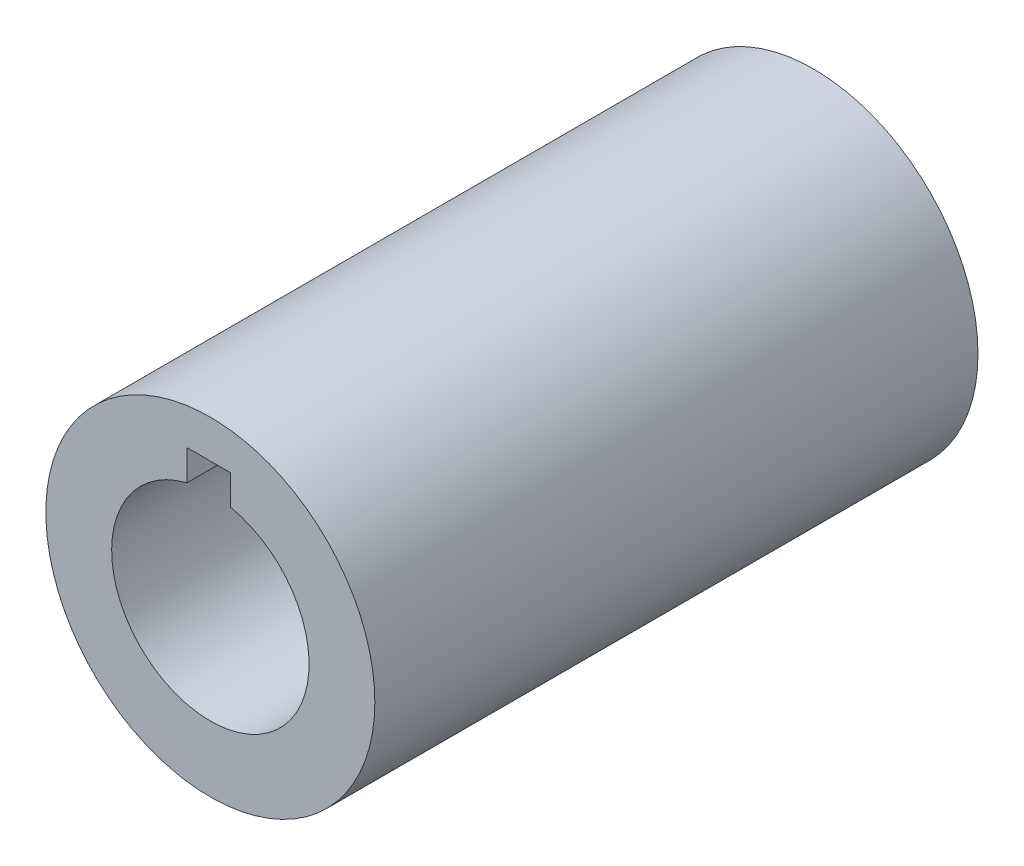
ISO-10303-21;
HEADER;
FILE_DESCRIPTION(('STEP AP214'),'2;1');
FILE_NAME('part.step','',(''),(''),'','','');
FILE_SCHEMA(('AUTOMOTIVE_DESIGN { 1 0 10303 214 1 1 1 1 }'));
ENDSEC;
DATA;
#1=APPLICATION_CONTEXT('core data for automotive mechanical design processes');
#2=APPLICATION_PROTOCOL_DEFINITION('international standard','automotive_design',2000,#1);
#3=PRODUCT_CONTEXT('',#1,'mechanical');
#4=PRODUCT('Part','Part','',(#3));
#5=PRODUCT_RELATED_PRODUCT_CATEGORY('part','',(#4));
#6=PRODUCT_DEFINITION_FORMATION('','',#4);
#7=PRODUCT_DEFINITION_CONTEXT('part definition',#1,'design');
#8=PRODUCT_DEFINITION('design','',#6,#7);
#9=PRODUCT_DEFINITION_SHAPE('','',#8);
#10=(LENGTH_UNIT() NAMED_UNIT(*) SI_UNIT(.MILLI.,.METRE.));
#11=(NAMED_UNIT(*) PLANE_ANGLE_UNIT() SI_UNIT($,.RADIAN.));
#12=(NAMED_UNIT(*) SI_UNIT($,.STERADIAN.) SOLID_ANGLE_UNIT());
#13=UNCERTAINTY_MEASURE_WITH_UNIT(LENGTH_MEASURE(1.E-05),#10,'distance_accuracy_value','');
#14=(GEOMETRIC_REPRESENTATION_CONTEXT(3) GLOBAL_UNCERTAINTY_ASSIGNED_CONTEXT((#13)) GLOBAL_UNIT_ASSIGNED_CONTEXT((#10,
#11,#12)) REPRESENTATION_CONTEXT('',''));
#15=CARTESIAN_POINT('',(0.,0.,0.));
#16=DIRECTION('',(0.,0.,1.));
#17=DIRECTION('',(1.,0.,0.));
#18=AXIS2_PLACEMENT_3D('',#15,#16,#17);
#19=CARTESIAN_POINT('',(0.142780767742801,-8.51132170729918,55.));
#20=DIRECTION('',(0.,0.,1.));
#21=DIRECTION('',(1.,0.,0.));
#22=AXIS2_PLACEMENT_3D('',#19,#20,#21);
#23=PLANE('',#22);
#24=CARTESIAN_POINT('',(0.142780767742801,-8.51132170729918,55.));
#25=DIRECTION('',(0.,0.,1.));
#26=DIRECTION('',(1.,0.,0.));
#27=AXIS2_PLACEMENT_3D('',#24,#25,#26);
#28=CIRCLE('',#27,15.);
#29=CARTESIAN_POINT('',(15.1427807677428,-8.51132170729918,55.));
#30=VERTEX_POINT('',#29);
#31=EDGE_CURVE('E11',#30,#30,#28,.T.);
#32=ORIENTED_EDGE('',*,*,#31,.T.);
#33=EDGE_LOOP('',(#32));
#34=FACE_BOUND('',#33,.T.);
#35=DIRECTION('',(-1.,0.,0.));
#36=VECTOR('',#35,1.);
#37=CARTESIAN_POINT('',(2.,3.01641607289805,55.));
#38=LINE('',#37,#36);
#39=CARTESIAN_POINT('',(2.,3.01641607289805,55.));
#40=VERTEX_POINT('',#39);
#41=CARTESIAN_POINT('',(-2.,3.01641607289805,55.));
#42=VERTEX_POINT('',#41);
#43=EDGE_CURVE('E82',#40,#42,#38,.T.);
#44=ORIENTED_EDGE('',*,*,#43,.F.);
#45=DIRECTION('',(0.,1.,0.));
#46=VECTOR('',#45,1.);
#47=CARTESIAN_POINT('',(2.,3.01641607289805,55.));
#48=LINE('',#47,#46);
#49=CARTESIAN_POINT('',(2.,0.294967904298546,55.));
#50=VERTEX_POINT('',#49);
#51=EDGE_CURVE('E74',#50,#40,#48,.T.);
#52=ORIENTED_EDGE('',*,*,#51,.F.);
#53=CARTESIAN_POINT('',(0.142780767742801,-8.51132170729918,55.));
#54=DIRECTION('',(0.,0.,1.));
#55=DIRECTION('',(1.,0.,0.));
#56=AXIS2_PLACEMENT_3D('',#53,#54,#55);
#57=CIRCLE('',#56,9.);
#58=CARTESIAN_POINT('',(-2.,0.229873324353622,55.));
#59=VERTEX_POINT('',#58);
#60=EDGE_CURVE('E95',#59,#50,#57,.T.);
#61=ORIENTED_EDGE('',*,*,#60,.F.);
#62=DIRECTION('',(0.,-1.,0.));
#63=VECTOR('',#62,1.);
#64=CARTESIAN_POINT('',(-2.,3.01641607289805,55.));
#65=LINE('',#64,#63);
#66=EDGE_CURVE('E93',#42,#59,#65,.T.);
#67=ORIENTED_EDGE('',*,*,#66,.F.);
#68=EDGE_LOOP('',(#44,#52,#61,#67));
#69=FACE_BOUND('',#68,.T.);
#70=ADVANCED_FACE('F33',(#34,#69),#23,.T.);
#71=CARTESIAN_POINT('',(0.142780767742801,-8.51132170729918,0.));
#72=DIRECTION('',(0.,0.,1.));
#73=DIRECTION('',(1.,0.,0.));
#74=AXIS2_PLACEMENT_3D('',#71,#72,#73);
#75=PLANE('',#74);
#76=CARTESIAN_POINT('',(0.142780767742801,-8.51132170729918,0.));
#77=DIRECTION('',(0.,0.,1.));
#78=DIRECTION('',(1.,0.,0.));
#79=AXIS2_PLACEMENT_3D('',#76,#77,#78);
#80=CIRCLE('',#79,15.);
#81=CARTESIAN_POINT('',(15.1427807677428,-8.51132170729918,0.));
#82=VERTEX_POINT('',#81);
#83=EDGE_CURVE('E37',#82,#82,#80,.T.);
#84=ORIENTED_EDGE('',*,*,#83,.F.);
#85=EDGE_LOOP('',(#84));
#86=FACE_BOUND('',#85,.T.);
#87=DIRECTION('',(0.,1.,0.));
#88=VECTOR('',#87,1.);
#89=CARTESIAN_POINT('',(2.,3.01641607289805,0.));
#90=LINE('',#89,#88);
#91=CARTESIAN_POINT('',(2.,0.294967904298546,0.));
#92=VERTEX_POINT('',#91);
#93=CARTESIAN_POINT('',(2.,3.01641607289805,0.));
#94=VERTEX_POINT('',#93);
#95=EDGE_CURVE('E56',#92,#94,#90,.T.);
#96=ORIENTED_EDGE('',*,*,#95,.T.);
#97=DIRECTION('',(-1.,0.,0.));
#98=VECTOR('',#97,1.);
#99=CARTESIAN_POINT('',(2.,3.01641607289805,0.));
#100=LINE('',#99,#98);
#101=CARTESIAN_POINT('',(-2.,3.01641607289805,0.));
#102=VERTEX_POINT('',#101);
#103=EDGE_CURVE('E89',#94,#102,#100,.T.);
#104=ORIENTED_EDGE('',*,*,#103,.T.);
#105=DIRECTION('',(0.,-1.,0.));
#106=VECTOR('',#105,1.);
#107=CARTESIAN_POINT('',(-2.,3.01641607289805,0.));
#108=LINE('',#107,#106);
#109=CARTESIAN_POINT('',(-2.,0.229873324353622,0.));
#110=VERTEX_POINT('',#109);
#111=EDGE_CURVE('E101',#102,#110,#108,.T.);
#112=ORIENTED_EDGE('',*,*,#111,.T.);
#113=CARTESIAN_POINT('',(0.142780767742801,-8.51132170729918,0.));
#114=DIRECTION('',(0.,0.,1.));
#115=DIRECTION('',(1.,0.,0.));
#116=AXIS2_PLACEMENT_3D('',#113,#114,#115);
#117=CIRCLE('',#116,9.);
#118=EDGE_CURVE('E83',#110,#92,#117,.T.);
#119=ORIENTED_EDGE('',*,*,#118,.T.);
#120=EDGE_LOOP('',(#96,#104,#112,#119));
#121=FACE_BOUND('',#120,.T.);
#122=ADVANCED_FACE('F112',(#86,#121),#75,.F.);
#123=CARTESIAN_POINT('',(0.142780767742801,-8.51132170729918,55.));
#124=DIRECTION('',(0.,0.,-1.));
#125=DIRECTION('',(-1.,0.,0.));
#126=AXIS2_PLACEMENT_3D('',#123,#124,#125);
#127=CYLINDRICAL_SURFACE('',#126,15.);
#128=ORIENTED_EDGE('',*,*,#31,.F.);
#129=EDGE_LOOP('',(#128));
#130=FACE_BOUND('',#129,.T.);
#131=ORIENTED_EDGE('',*,*,#83,.T.);
#132=EDGE_LOOP('',(#131));
#133=FACE_BOUND('',#132,.T.);
#134=ADVANCED_FACE('F35',(#130,#133),#127,.T.);
#135=CARTESIAN_POINT('',(2.,3.01641607289805,55.));
#136=DIRECTION('',(-1.,0.,0.));
#137=DIRECTION('',(0.,0.,1.));
#138=AXIS2_PLACEMENT_3D('',#135,#136,#137);
#139=PLANE('',#138);
#140=ORIENTED_EDGE('',*,*,#95,.F.);
#141=DIRECTION('',(0.,0.,-1.));
#142=VECTOR('',#141,1.);
#143=CARTESIAN_POINT('',(2.,0.294967904298546,55.));
#144=LINE('',#143,#142);
#145=EDGE_CURVE('E78',#50,#92,#144,.T.);
#146=ORIENTED_EDGE('',*,*,#145,.F.);
#147=ORIENTED_EDGE('',*,*,#51,.T.);
#148=DIRECTION('',(0.,0.,-1.));
#149=VECTOR('',#148,1.);
#150=CARTESIAN_POINT('',(2.,3.01641607289805,55.));
#151=LINE('',#150,#149);
#152=EDGE_CURVE('E77',#40,#94,#151,.T.);
#153=ORIENTED_EDGE('',*,*,#152,.T.);
#154=EDGE_LOOP('',(#140,#146,#147,#153));
#155=FACE_BOUND('',#154,.T.);
#156=ADVANCED_FACE('F76',(#155),#139,.T.);
#157=CARTESIAN_POINT('',(2.,3.01641607289805,55.));
#158=DIRECTION('',(0.,-1.,0.));
#159=DIRECTION('',(0.,0.,-1.));
#160=AXIS2_PLACEMENT_3D('',#157,#158,#159);
#161=PLANE('',#160);
#162=ORIENTED_EDGE('',*,*,#103,.F.);
#163=ORIENTED_EDGE('',*,*,#152,.F.);
#164=ORIENTED_EDGE('',*,*,#43,.T.);
#165=DIRECTION('',(0.,0.,-1.));
#166=VECTOR('',#165,1.);
#167=CARTESIAN_POINT('',(-2.,3.01641607289805,55.));
#168=LINE('',#167,#166);
#169=EDGE_CURVE('E90',#42,#102,#168,.T.);
#170=ORIENTED_EDGE('',*,*,#169,.T.);
#171=EDGE_LOOP('',(#162,#163,#164,#170));
#172=FACE_BOUND('',#171,.T.);
#173=ADVANCED_FACE('F86',(#172),#161,.T.);
#174=CARTESIAN_POINT('',(-2.,3.01641607289805,55.));
#175=DIRECTION('',(1.,0.,0.));
#176=DIRECTION('',(0.,0.,-1.));
#177=AXIS2_PLACEMENT_3D('',#174,#175,#176);
#178=PLANE('',#177);
#179=ORIENTED_EDGE('',*,*,#111,.F.);
#180=ORIENTED_EDGE('',*,*,#169,.F.);
#181=ORIENTED_EDGE('',*,*,#66,.T.);
#182=DIRECTION('',(0.,0.,-1.));
#183=VECTOR('',#182,1.);
#184=CARTESIAN_POINT('',(-2.,0.229873324353622,55.));
#185=LINE('',#184,#183);
#186=EDGE_CURVE('E48',#59,#110,#185,.T.);
#187=ORIENTED_EDGE('',*,*,#186,.T.);
#188=EDGE_LOOP('',(#179,#180,#181,#187));
#189=FACE_BOUND('',#188,.T.);
#190=ADVANCED_FACE('F110',(#189),#178,.T.);
#191=CARTESIAN_POINT('',(0.142780767742801,-8.51132170729918,55.));
#192=DIRECTION('',(0.,0.,-1.));
#193=DIRECTION('',(-1.,0.,0.));
#194=AXIS2_PLACEMENT_3D('',#191,#192,#193);
#195=CYLINDRICAL_SURFACE('',#194,9.);
#196=ORIENTED_EDGE('',*,*,#118,.F.);
#197=ORIENTED_EDGE('',*,*,#186,.F.);
#198=ORIENTED_EDGE('',*,*,#60,.T.);
#199=ORIENTED_EDGE('',*,*,#145,.T.);
#200=EDGE_LOOP('',(#196,#197,#198,#199));
#201=FACE_BOUND('',#200,.T.);
#202=ADVANCED_FACE('F113',(#201),#195,.F.);
#203=CLOSED_SHELL('',(#70,#122,#134,#156,#173,#190,#202));
#204=MANIFOLD_SOLID_BREP('B2',#203);
#205=ADVANCED_BREP_SHAPE_REPRESENTATION('',(#18,#204),#14);
#206=SHAPE_DEFINITION_REPRESENTATION(#9,#205);
ENDSEC;
END-ISO-10303-21;
